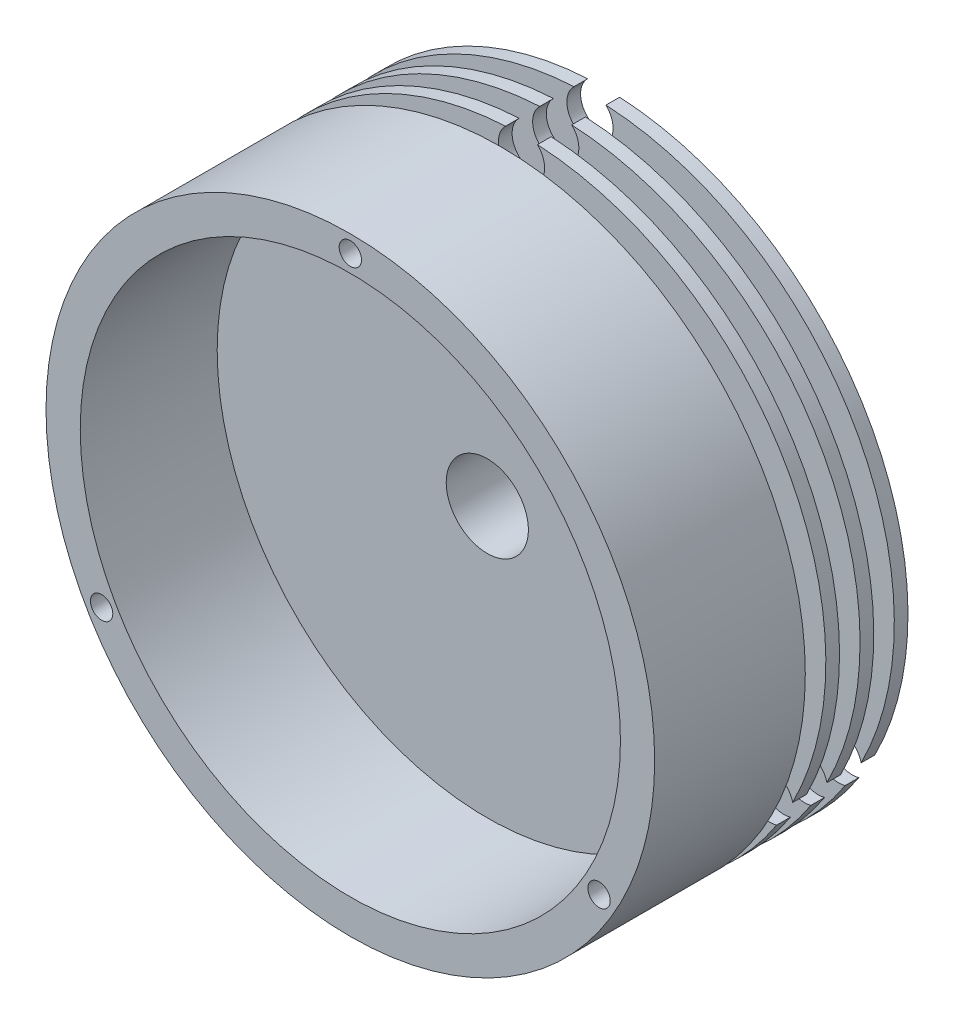
ISO-10303-21;
HEADER;
FILE_DESCRIPTION(('STEP AP214'),'2;1');
FILE_NAME('part.step','',(''),(''),'','','');
FILE_SCHEMA(('AUTOMOTIVE_DESIGN { 1 0 10303 214 1 1 1 1 }'));
ENDSEC;
DATA;
#1=APPLICATION_CONTEXT('core data for automotive mechanical design processes');
#2=APPLICATION_PROTOCOL_DEFINITION('international standard','automotive_design',2000,#1);
#3=PRODUCT_CONTEXT('',#1,'mechanical');
#4=PRODUCT('Part','Part','',(#3));
#5=PRODUCT_RELATED_PRODUCT_CATEGORY('part','',(#4));
#6=PRODUCT_DEFINITION_FORMATION('','',#4);
#7=PRODUCT_DEFINITION_CONTEXT('part definition',#1,'design');
#8=PRODUCT_DEFINITION('design','',#6,#7);
#9=PRODUCT_DEFINITION_SHAPE('','',#8);
#10=(LENGTH_UNIT() NAMED_UNIT(*) SI_UNIT(.MILLI.,.METRE.));
#11=(NAMED_UNIT(*) PLANE_ANGLE_UNIT() SI_UNIT($,.RADIAN.));
#12=(NAMED_UNIT(*) SI_UNIT($,.STERADIAN.) SOLID_ANGLE_UNIT());
#13=UNCERTAINTY_MEASURE_WITH_UNIT(LENGTH_MEASURE(1.E-05),#10,'distance_accuracy_value','');
#14=(GEOMETRIC_REPRESENTATION_CONTEXT(3) GLOBAL_UNCERTAINTY_ASSIGNED_CONTEXT((#13)) GLOBAL_UNIT_ASSIGNED_CONTEXT((#10,
#11,#12)) REPRESENTATION_CONTEXT('',''));
#15=CARTESIAN_POINT('',(0.,0.,0.));
#16=DIRECTION('',(0.,0.,1.));
#17=DIRECTION('',(1.,0.,0.));
#18=AXIS2_PLACEMENT_3D('',#15,#16,#17);
#19=CARTESIAN_POINT('',(0.,0.,20.));
#20=DIRECTION('',(0.,0.,1.));
#21=DIRECTION('',(1.,0.,0.));
#22=AXIS2_PLACEMENT_3D('',#19,#20,#21);
#23=PLANE('',#22);
#24=CARTESIAN_POINT('',(0.,0.,20.));
#25=DIRECTION('',(0.,0.,1.));
#26=DIRECTION('',(1.,0.,0.));
#27=AXIS2_PLACEMENT_3D('',#24,#25,#26);
#28=CIRCLE('',#27,39.45);
#29=CARTESIAN_POINT('',(39.45,0.,20.));
#30=VERTEX_POINT('',#29);
#31=EDGE_CURVE('E693',#30,#30,#28,.T.);
#32=ORIENTED_EDGE('',*,*,#31,.F.);
#33=EDGE_LOOP('',(#32));
#34=FACE_BOUND('',#33,.T.);
#35=CARTESIAN_POINT('',(0.,0.,20.));
#36=DIRECTION('',(0.,0.,1.));
#37=DIRECTION('',(1.,0.,0.));
#38=AXIS2_PLACEMENT_3D('',#35,#36,#37);
#39=CIRCLE('',#38,44.45);
#40=CARTESIAN_POINT('',(44.45,0.,20.));
#41=VERTEX_POINT('',#40);
#42=EDGE_CURVE('E691',#41,#41,#39,.T.);
#43=ORIENTED_EDGE('',*,*,#42,.T.);
#44=EDGE_LOOP('',(#43));
#45=FACE_BOUND('',#44,.T.);
#46=CARTESIAN_POINT('',(0.,41.95,20.));
#47=DIRECTION('',(0.,0.,-1.));
#48=DIRECTION('',(-1.,0.,0.));
#49=AXIS2_PLACEMENT_3D('',#46,#47,#48);
#50=CIRCLE('',#49,1.63194999999999);
#51=CARTESIAN_POINT('',(-1.63194999999999,41.95,20.));
#52=VERTEX_POINT('',#51);
#53=EDGE_CURVE('E272',#52,#52,#50,.T.);
#54=ORIENTED_EDGE('',*,*,#53,.T.);
#55=EDGE_LOOP('',(#54));
#56=FACE_BOUND('',#55,.T.);
#57=CARTESIAN_POINT('',(-36.3297656887571,-20.9750000000002,20.));
#58=DIRECTION('',(0.,0.,-1.));
#59=DIRECTION('',(-1.,0.,0.));
#60=AXIS2_PLACEMENT_3D('',#57,#58,#59);
#61=CIRCLE('',#60,1.63194999999999);
#62=CARTESIAN_POINT('',(-37.9617156887571,-20.9750000000002,20.));
#63=VERTEX_POINT('',#62);
#64=EDGE_CURVE('E304',#63,#63,#61,.T.);
#65=ORIENTED_EDGE('',*,*,#64,.T.);
#66=EDGE_LOOP('',(#65));
#67=FACE_BOUND('',#66,.T.);
#68=CARTESIAN_POINT('',(36.3297656887574,-20.9749999999997,20.));
#69=DIRECTION('',(0.,0.,-1.));
#70=DIRECTION('',(-1.,0.,0.));
#71=AXIS2_PLACEMENT_3D('',#68,#69,#70);
#72=CIRCLE('',#71,1.63194999999999);
#73=CARTESIAN_POINT('',(34.6978156887574,-20.9749999999997,20.));
#74=VERTEX_POINT('',#73);
#75=EDGE_CURVE('E164',#74,#74,#72,.T.);
#76=ORIENTED_EDGE('',*,*,#75,.T.);
#77=EDGE_LOOP('',(#76));
#78=FACE_BOUND('',#77,.T.);
#79=ADVANCED_FACE('F33',(#34,#45,#56,#67,#78),#23,.T.);
#80=CARTESIAN_POINT('',(0.,0.,20.));
#81=DIRECTION('',(0.,0.,-1.));
#82=DIRECTION('',(-1.,0.,0.));
#83=AXIS2_PLACEMENT_3D('',#80,#81,#82);
#84=CYLINDRICAL_SURFACE('',#83,44.45);
#85=CARTESIAN_POINT('',(0.,0.,-17.));
#86=DIRECTION('',(0.,0.,-1.));
#87=DIRECTION('',(-1.,0.,0.));
#88=AXIS2_PLACEMENT_3D('',#85,#86,#87);
#89=CIRCLE('',#88,44.45);
#90=CARTESIAN_POINT('',(37.2768013419675,-24.2124468344588,-17.));
#91=VERTEX_POINT('',#90);
#92=CARTESIAN_POINT('',(-37.2768013419671,-24.2124468344593,-17.));
#93=VERTEX_POINT('',#92);
#94=EDGE_CURVE('E181',#91,#93,#89,.T.);
#95=ORIENTED_EDGE('',*,*,#94,.F.);
#96=DIRECTION('',(0.,0.,-1.));
#97=VECTOR('',#96,1.);
#98=CARTESIAN_POINT('',(37.2768013419674,-24.2124468344587,-9.7864));
#99=LINE('',#98,#97);
#100=CARTESIAN_POINT('',(37.2768013419675,-24.2124468344588,-15.));
#101=VERTEX_POINT('',#100);
#102=EDGE_CURVE('E57',#91,#101,#99,.F.);
#103=ORIENTED_EDGE('',*,*,#102,.T.);
#104=CARTESIAN_POINT('',(0.,0.,-15.));
#105=DIRECTION('',(0.,0.,-1.));
#106=DIRECTION('',(-1.,0.,0.));
#107=AXIS2_PLACEMENT_3D('',#104,#105,#106);
#108=CIRCLE('',#107,44.45);
#109=CARTESIAN_POINT('',(-37.2768013419671,-24.2124468344593,-15.));
#110=VERTEX_POINT('',#109);
#111=EDGE_CURVE('E234',#101,#110,#108,.T.);
#112=ORIENTED_EDGE('',*,*,#111,.T.);
#113=DIRECTION('',(0.,0.,-1.));
#114=VECTOR('',#113,1.);
#115=CARTESIAN_POINT('',(-37.2768013419671,-24.2124468344593,-9.7864));
#116=LINE('',#115,#114);
#117=EDGE_CURVE('E280',#110,#93,#116,.T.);
#118=ORIENTED_EDGE('',*,*,#117,.T.);
#119=EDGE_LOOP('',(#95,#103,#112,#118));
#120=FACE_BOUND('',#119,.T.);
#121=ADVANCED_FACE('F343',(#120),#84,.T.);
#122=CARTESIAN_POINT('',(0.,0.,-12.));
#123=DIRECTION('',(0.,0.,-1.));
#124=DIRECTION('',(-1.,0.,0.));
#125=AXIS2_PLACEMENT_3D('',#122,#123,#124);
#126=CIRCLE('',#125,44.45);
#127=CARTESIAN_POINT('',(37.2768013419675,-24.2124468344587,-12.));
#128=VERTEX_POINT('',#127);
#129=CARTESIAN_POINT('',(-37.2768013419671,-24.2124468344593,-12.));
#130=VERTEX_POINT('',#129);
#131=EDGE_CURVE('E238',#128,#130,#126,.T.);
#132=ORIENTED_EDGE('',*,*,#131,.F.);
#133=DIRECTION('',(0.,0.,-1.));
#134=VECTOR('',#133,1.);
#135=CARTESIAN_POINT('',(37.2768013419674,-24.2124468344587,-9.7864));
#136=LINE('',#135,#134);
#137=CARTESIAN_POINT('',(37.2768013419675,-24.2124468344588,-10.));
#138=VERTEX_POINT('',#137);
#139=EDGE_CURVE('E313',#128,#138,#136,.F.);
#140=ORIENTED_EDGE('',*,*,#139,.T.);
#141=CARTESIAN_POINT('',(0.,0.,-10.));
#142=DIRECTION('',(0.,0.,-1.));
#143=DIRECTION('',(-1.,0.,0.));
#144=AXIS2_PLACEMENT_3D('',#141,#142,#143);
#145=CIRCLE('',#144,44.45);
#146=CARTESIAN_POINT('',(-37.2768013419671,-24.2124468344593,-10.));
#147=VERTEX_POINT('',#146);
#148=EDGE_CURVE('E220',#138,#147,#145,.T.);
#149=ORIENTED_EDGE('',*,*,#148,.T.);
#150=DIRECTION('',(0.,0.,-1.));
#151=VECTOR('',#150,1.);
#152=CARTESIAN_POINT('',(-37.2768013419671,-24.2124468344593,-9.7864));
#153=LINE('',#152,#151);
#154=EDGE_CURVE('E441',#147,#130,#153,.T.);
#155=ORIENTED_EDGE('',*,*,#154,.T.);
#156=EDGE_LOOP('',(#132,#140,#149,#155));
#157=FACE_BOUND('',#156,.T.);
#158=ADVANCED_FACE('F348',(#157),#84,.T.);
#159=CARTESIAN_POINT('',(0.,0.,-7.));
#160=DIRECTION('',(0.,0.,-1.));
#161=DIRECTION('',(-1.,0.,0.));
#162=AXIS2_PLACEMENT_3D('',#159,#160,#161);
#163=CIRCLE('',#162,44.45);
#164=CARTESIAN_POINT('',(37.2768013419675,-24.2124468344588,-7.));
#165=VERTEX_POINT('',#164);
#166=CARTESIAN_POINT('',(-37.2768013419671,-24.2124468344593,-7.));
#167=VERTEX_POINT('',#166);
#168=EDGE_CURVE('E226',#165,#167,#163,.T.);
#169=ORIENTED_EDGE('',*,*,#168,.F.);
#170=DIRECTION('',(0.,0.,-1.));
#171=VECTOR('',#170,1.);
#172=CARTESIAN_POINT('',(37.2768013419674,-24.2124468344587,-9.7864));
#173=LINE('',#172,#171);
#174=CARTESIAN_POINT('',(37.2768013419675,-24.2124468344588,-5.));
#175=VERTEX_POINT('',#174);
#176=EDGE_CURVE('E11',#165,#175,#173,.F.);
#177=ORIENTED_EDGE('',*,*,#176,.T.);
#178=CARTESIAN_POINT('',(0.,0.,-5.));
#179=DIRECTION('',(0.,0.,-1.));
#180=DIRECTION('',(-1.,0.,0.));
#181=AXIS2_PLACEMENT_3D('',#178,#179,#180);
#182=CIRCLE('',#181,44.45);
#183=CARTESIAN_POINT('',(-37.2768013419671,-24.2124468344593,-5.));
#184=VERTEX_POINT('',#183);
#185=EDGE_CURVE('E204',#175,#184,#182,.T.);
#186=ORIENTED_EDGE('',*,*,#185,.T.);
#187=DIRECTION('',(0.,0.,-1.));
#188=VECTOR('',#187,1.);
#189=CARTESIAN_POINT('',(-37.2768013419671,-24.2124468344593,-9.7864));
#190=LINE('',#189,#188);
#191=EDGE_CURVE('E295',#184,#167,#190,.T.);
#192=ORIENTED_EDGE('',*,*,#191,.T.);
#193=EDGE_LOOP('',(#169,#177,#186,#192));
#194=FACE_BOUND('',#193,.T.);
#195=ADVANCED_FACE('F478',(#194),#84,.T.);
#196=CARTESIAN_POINT('',(-39.6069947174052,-20.1764335167401,-17.));
#197=VERTEX_POINT('',#196);
#198=CARTESIAN_POINT('',(-2.33019337543807,44.388880351199,-17.));
#199=VERTEX_POINT('',#198);
#200=EDGE_CURVE('E183',#197,#199,#89,.T.);
#201=ORIENTED_EDGE('',*,*,#200,.F.);
#202=DIRECTION('',(0.,0.,-1.));
#203=VECTOR('',#202,1.);
#204=CARTESIAN_POINT('',(-39.6069947174052,-20.1764335167401,-9.7864));
#205=LINE('',#204,#203);
#206=CARTESIAN_POINT('',(-39.6069947174053,-20.1764335167401,-15.));
#207=VERTEX_POINT('',#206);
#208=EDGE_CURVE('E277',#197,#207,#205,.F.);
#209=ORIENTED_EDGE('',*,*,#208,.T.);
#210=CARTESIAN_POINT('',(-2.33019337543812,44.3888803511991,-15.));
#211=VERTEX_POINT('',#210);
#212=EDGE_CURVE('E235',#207,#211,#108,.T.);
#213=ORIENTED_EDGE('',*,*,#212,.T.);
#214=DIRECTION('',(0.,0.,-1.));
#215=VECTOR('',#214,1.);
#216=CARTESIAN_POINT('',(-2.33019337543807,44.388880351199,-9.7864));
#217=LINE('',#216,#215);
#218=EDGE_CURVE('E248',#211,#199,#217,.T.);
#219=ORIENTED_EDGE('',*,*,#218,.T.);
#220=EDGE_LOOP('',(#201,#209,#213,#219));
#221=FACE_BOUND('',#220,.T.);
#222=ADVANCED_FACE('F549',(#221),#84,.T.);
#223=CARTESIAN_POINT('',(-39.6069947174053,-20.1764335167401,-7.));
#224=VERTEX_POINT('',#223);
#225=CARTESIAN_POINT('',(-2.33019337543808,44.3888803511991,-7.));
#226=VERTEX_POINT('',#225);
#227=EDGE_CURVE('E219',#224,#226,#163,.T.);
#228=ORIENTED_EDGE('',*,*,#227,.F.);
#229=DIRECTION('',(0.,0.,-1.));
#230=VECTOR('',#229,1.);
#231=CARTESIAN_POINT('',(-39.6069947174052,-20.1764335167401,-9.7864));
#232=LINE('',#231,#230);
#233=CARTESIAN_POINT('',(-39.6069947174053,-20.1764335167401,-5.));
#234=VERTEX_POINT('',#233);
#235=EDGE_CURVE('E286',#224,#234,#232,.F.);
#236=ORIENTED_EDGE('',*,*,#235,.T.);
#237=CARTESIAN_POINT('',(-2.33019337543808,44.3888803511991,-5.));
#238=VERTEX_POINT('',#237);
#239=EDGE_CURVE('E205',#234,#238,#182,.T.);
#240=ORIENTED_EDGE('',*,*,#239,.T.);
#241=DIRECTION('',(0.,0.,-1.));
#242=VECTOR('',#241,1.);
#243=CARTESIAN_POINT('',(-2.33019337543807,44.388880351199,-9.7864));
#244=LINE('',#243,#242);
#245=EDGE_CURVE('E263',#238,#226,#244,.T.);
#246=ORIENTED_EDGE('',*,*,#245,.T.);
#247=EDGE_LOOP('',(#228,#236,#240,#246));
#248=FACE_BOUND('',#247,.T.);
#249=ADVANCED_FACE('F472',(#248),#84,.T.);
#250=CARTESIAN_POINT('',(-39.6069947174053,-20.1764335167401,-12.));
#251=VERTEX_POINT('',#250);
#252=CARTESIAN_POINT('',(-2.33019337543808,44.3888803511991,-12.));
#253=VERTEX_POINT('',#252);
#254=EDGE_CURVE('E233',#251,#253,#126,.T.);
#255=ORIENTED_EDGE('',*,*,#254,.F.);
#256=DIRECTION('',(0.,0.,-1.));
#257=VECTOR('',#256,1.);
#258=CARTESIAN_POINT('',(-39.6069947174052,-20.1764335167401,-9.7864));
#259=LINE('',#258,#257);
#260=CARTESIAN_POINT('',(-39.6069947174053,-20.1764335167401,-10.));
#261=VERTEX_POINT('',#260);
#262=EDGE_CURVE('E443',#251,#261,#259,.F.);
#263=ORIENTED_EDGE('',*,*,#262,.T.);
#264=CARTESIAN_POINT('',(-2.33019337543808,44.3888803511991,-10.));
#265=VERTEX_POINT('',#264);
#266=EDGE_CURVE('E221',#261,#265,#145,.T.);
#267=ORIENTED_EDGE('',*,*,#266,.T.);
#268=DIRECTION('',(0.,0.,-1.));
#269=VECTOR('',#268,1.);
#270=CARTESIAN_POINT('',(-2.33019337543807,44.388880351199,-9.7864));
#271=LINE('',#270,#269);
#272=EDGE_CURVE('E452',#265,#253,#271,.T.);
#273=ORIENTED_EDGE('',*,*,#272,.T.);
#274=EDGE_LOOP('',(#255,#263,#267,#273));
#275=FACE_BOUND('',#274,.T.);
#276=ADVANCED_FACE('F567',(#275),#84,.T.);
#277=ORIENTED_EDGE('',*,*,#42,.F.);
#278=EDGE_LOOP('',(#277));
#279=FACE_BOUND('',#278,.T.);
#280=CARTESIAN_POINT('',(0.,0.,-2.));
#281=DIRECTION('',(0.,0.,-1.));
#282=DIRECTION('',(-1.,0.,0.));
#283=AXIS2_PLACEMENT_3D('',#280,#281,#282);
#284=CIRCLE('',#283,44.45);
#285=CARTESIAN_POINT('',(-44.45,0.,-2.));
#286=VERTEX_POINT('',#285);
#287=EDGE_CURVE('E203',#286,#286,#284,.T.);
#288=ORIENTED_EDGE('',*,*,#287,.F.);
#289=EDGE_LOOP('',(#288));
#290=FACE_BOUND('',#289,.T.);
#291=ADVANCED_FACE('F576',(#279,#290),#84,.T.);
#292=CARTESIAN_POINT('',(2.33019337543812,44.3888803511991,-15.));
#293=VERTEX_POINT('',#292);
#294=CARTESIAN_POINT('',(39.6069947174055,-20.1764335167396,-15.));
#295=VERTEX_POINT('',#294);
#296=EDGE_CURVE('E172',#293,#295,#108,.T.);
#297=ORIENTED_EDGE('',*,*,#296,.T.);
#298=DIRECTION('',(0.,0.,-1.));
#299=VECTOR('',#298,1.);
#300=CARTESIAN_POINT('',(39.6069947174055,-20.1764335167396,-9.7864));
#301=LINE('',#300,#299);
#302=CARTESIAN_POINT('',(39.6069947174055,-20.1764335167396,-17.));
#303=VERTEX_POINT('',#302);
#304=EDGE_CURVE('E159',#295,#303,#301,.T.);
#305=ORIENTED_EDGE('',*,*,#304,.T.);
#306=CARTESIAN_POINT('',(2.33019337543807,44.388880351199,-17.));
#307=VERTEX_POINT('',#306);
#308=EDGE_CURVE('E170',#307,#303,#89,.T.);
#309=ORIENTED_EDGE('',*,*,#308,.F.);
#310=DIRECTION('',(0.,0.,-1.));
#311=VECTOR('',#310,1.);
#312=CARTESIAN_POINT('',(2.33019337543807,44.388880351199,-9.7864));
#313=LINE('',#312,#311);
#314=EDGE_CURVE('E246',#307,#293,#313,.F.);
#315=ORIENTED_EDGE('',*,*,#314,.T.);
#316=EDGE_LOOP('',(#297,#305,#309,#315));
#317=FACE_BOUND('',#316,.T.);
#318=ADVANCED_FACE('F35',(#317),#84,.T.);
#319=CARTESIAN_POINT('',(0.,0.,-20.));
#320=DIRECTION('',(0.,0.,-1.));
#321=DIRECTION('',(-1.,0.,0.));
#322=AXIS2_PLACEMENT_3D('',#319,#320,#321);
#323=PLANE('',#322);
#324=CARTESIAN_POINT('',(0.,0.,-20.));
#325=DIRECTION('',(0.,0.,-1.));
#326=DIRECTION('',(-1.,0.,0.));
#327=AXIS2_PLACEMENT_3D('',#324,#325,#326);
#328=CIRCLE('',#327,6.);
#329=CARTESIAN_POINT('',(-6.,0.,-20.));
#330=VERTEX_POINT('',#329);
#331=EDGE_CURVE('E185',#330,#330,#328,.T.);
#332=ORIENTED_EDGE('',*,*,#331,.F.);
#333=EDGE_LOOP('',(#332));
#334=FACE_BOUND('',#333,.T.);
#335=CARTESIAN_POINT('',(0.,0.,-20.));
#336=DIRECTION('',(0.,0.,-1.));
#337=DIRECTION('',(-1.,0.,0.));
#338=AXIS2_PLACEMENT_3D('',#335,#336,#337);
#339=CIRCLE('',#338,33.45);
#340=CARTESIAN_POINT('',(-33.45,0.,-20.));
#341=VERTEX_POINT('',#340);
#342=EDGE_CURVE('E193',#341,#341,#339,.T.);
#343=ORIENTED_EDGE('',*,*,#342,.T.);
#344=EDGE_LOOP('',(#343));
#345=FACE_BOUND('',#344,.T.);
#346=ADVANCED_FACE('F357',(#334,#345),#323,.T.);
#347=CARTESIAN_POINT('',(0.,0.,20.));
#348=DIRECTION('',(0.,0.,-1.));
#349=DIRECTION('',(-1.,0.,0.));
#350=AXIS2_PLACEMENT_3D('',#347,#348,#349);
#351=CYLINDRICAL_SURFACE('',#350,39.45);
#352=ORIENTED_EDGE('',*,*,#31,.T.);
#353=EDGE_LOOP('',(#352));
#354=FACE_BOUND('',#353,.T.);
#355=CARTESIAN_POINT('',(0.,0.,0.));
#356=DIRECTION('',(0.,0.,1.));
#357=DIRECTION('',(1.,0.,0.));
#358=AXIS2_PLACEMENT_3D('',#355,#356,#357);
#359=CIRCLE('',#358,39.45);
#360=CARTESIAN_POINT('',(39.45,0.,0.));
#361=VERTEX_POINT('',#360);
#362=EDGE_CURVE('E696',#361,#361,#359,.T.);
#363=ORIENTED_EDGE('',*,*,#362,.F.);
#364=EDGE_LOOP('',(#363));
#365=FACE_BOUND('',#364,.T.);
#366=ADVANCED_FACE('F353',(#354,#365),#351,.F.);
#367=CARTESIAN_POINT('',(0.,0.,0.));
#368=DIRECTION('',(0.,0.,-1.));
#369=DIRECTION('',(-1.,0.,0.));
#370=AXIS2_PLACEMENT_3D('',#367,#368,#369);
#371=PLANE('',#370);
#372=CARTESIAN_POINT('',(0.,0.,0.));
#373=DIRECTION('',(0.,0.,-1.));
#374=DIRECTION('',(-1.,0.,0.));
#375=AXIS2_PLACEMENT_3D('',#372,#373,#374);
#376=CIRCLE('',#375,6.);
#377=CARTESIAN_POINT('',(-6.,0.,0.));
#378=VERTEX_POINT('',#377);
#379=EDGE_CURVE('E180',#378,#378,#376,.T.);
#380=ORIENTED_EDGE('',*,*,#379,.T.);
#381=EDGE_LOOP('',(#380));
#382=FACE_BOUND('',#381,.T.);
#383=ORIENTED_EDGE('',*,*,#362,.T.);
#384=EDGE_LOOP('',(#383));
#385=FACE_BOUND('',#384,.T.);
#386=ADVANCED_FACE('F356',(#382,#385),#371,.F.);
#387=CARTESIAN_POINT('',(0.,0.,-20.));
#388=DIRECTION('',(0.,0.,1.));
#389=DIRECTION('',(1.,0.,0.));
#390=AXIS2_PLACEMENT_3D('',#387,#388,#389);
#391=CYLINDRICAL_SURFACE('',#390,6.);
#392=ORIENTED_EDGE('',*,*,#331,.T.);
#393=EDGE_LOOP('',(#392));
#394=FACE_BOUND('',#393,.T.);
#395=ORIENTED_EDGE('',*,*,#379,.F.);
#396=EDGE_LOOP('',(#395));
#397=FACE_BOUND('',#396,.T.);
#398=ADVANCED_FACE('F361',(#394,#397),#391,.F.);
#399=CARTESIAN_POINT('',(0.,0.,-17.));
#400=DIRECTION('',(0.,0.,-1.));
#401=DIRECTION('',(-1.,0.,0.));
#402=AXIS2_PLACEMENT_3D('',#399,#400,#401);
#403=PLANE('',#402);
#404=CARTESIAN_POINT('',(36.3297656887574,-20.9749999999997,-17.));
#405=DIRECTION('',(0.,0.,-1.));
#406=DIRECTION('',(-1.,0.,0.));
#407=AXIS2_PLACEMENT_3D('',#404,#405,#406);
#408=CIRCLE('',#407,3.37311999999999);
#409=EDGE_CURVE('E156',#91,#303,#408,.T.);
#410=ORIENTED_EDGE('',*,*,#409,.F.);
#411=ORIENTED_EDGE('',*,*,#94,.T.);
#412=CARTESIAN_POINT('',(-36.3297656887571,-20.9750000000002,-17.));
#413=DIRECTION('',(0.,0.,-1.));
#414=DIRECTION('',(-1.,0.,0.));
#415=AXIS2_PLACEMENT_3D('',#412,#413,#414);
#416=CIRCLE('',#415,3.37311999999999);
#417=EDGE_CURVE('E307',#197,#93,#416,.T.);
#418=ORIENTED_EDGE('',*,*,#417,.F.);
#419=ORIENTED_EDGE('',*,*,#200,.T.);
#420=CARTESIAN_POINT('',(0.,41.95,-17.));
#421=DIRECTION('',(0.,0.,-1.));
#422=DIRECTION('',(-1.,0.,0.));
#423=AXIS2_PLACEMENT_3D('',#420,#421,#422);
#424=CIRCLE('',#423,3.37311999999999);
#425=EDGE_CURVE('E179',#307,#199,#424,.T.);
#426=ORIENTED_EDGE('',*,*,#425,.F.);
#427=ORIENTED_EDGE('',*,*,#308,.T.);
#428=EDGE_LOOP('',(#410,#411,#418,#419,#426,#427));
#429=FACE_BOUND('',#428,.T.);
#430=CARTESIAN_POINT('',(0.,0.,-17.));
#431=DIRECTION('',(0.,0.,-1.));
#432=DIRECTION('',(-1.,0.,0.));
#433=AXIS2_PLACEMENT_3D('',#430,#431,#432);
#434=CIRCLE('',#433,33.45);
#435=CARTESIAN_POINT('',(-33.45,0.,-17.));
#436=VERTEX_POINT('',#435);
#437=EDGE_CURVE('E189',#436,#436,#434,.T.);
#438=ORIENTED_EDGE('',*,*,#437,.F.);
#439=EDGE_LOOP('',(#438));
#440=FACE_BOUND('',#439,.T.);
#441=ADVANCED_FACE('F176',(#429,#440),#403,.T.);
#442=CARTESIAN_POINT('',(0.,0.,-17.));
#443=DIRECTION('',(0.,0.,-1.));
#444=DIRECTION('',(-1.,0.,0.));
#445=AXIS2_PLACEMENT_3D('',#442,#443,#444);
#446=CYLINDRICAL_SURFACE('',#445,33.45);
#447=ORIENTED_EDGE('',*,*,#437,.T.);
#448=EDGE_LOOP('',(#447));
#449=FACE_BOUND('',#448,.T.);
#450=ORIENTED_EDGE('',*,*,#342,.F.);
#451=EDGE_LOOP('',(#450));
#452=FACE_BOUND('',#451,.T.);
#453=ADVANCED_FACE('F371',(#449,#452),#446,.T.);
#454=CARTESIAN_POINT('',(0.,0.,-2.));
#455=DIRECTION('',(0.,0.,-1.));
#456=DIRECTION('',(-1.,0.,0.));
#457=AXIS2_PLACEMENT_3D('',#454,#455,#456);
#458=PLANE('',#457);
#459=CARTESIAN_POINT('',(36.3297656887574,-20.9749999999997,-2.));
#460=DIRECTION('',(0.,0.,-1.));
#461=DIRECTION('',(-1.,0.,0.));
#462=AXIS2_PLACEMENT_3D('',#459,#460,#461);
#463=CIRCLE('',#462,1.63194999999999);
#464=CARTESIAN_POINT('',(34.6978156887574,-20.9749999999997,-2.));
#465=VERTEX_POINT('',#464);
#466=EDGE_CURVE('E37',#465,#465,#463,.T.);
#467=ORIENTED_EDGE('',*,*,#466,.F.);
#468=EDGE_LOOP('',(#467));
#469=FACE_BOUND('',#468,.T.);
#470=CARTESIAN_POINT('',(-36.3297656887571,-20.9750000000002,-2.));
#471=DIRECTION('',(0.,0.,-1.));
#472=DIRECTION('',(-1.,0.,0.));
#473=AXIS2_PLACEMENT_3D('',#470,#471,#472);
#474=CIRCLE('',#473,1.63194999999999);
#475=CARTESIAN_POINT('',(-37.9617156887571,-20.9750000000002,-2.));
#476=VERTEX_POINT('',#475);
#477=EDGE_CURVE('E276',#476,#476,#474,.T.);
#478=ORIENTED_EDGE('',*,*,#477,.F.);
#479=EDGE_LOOP('',(#478));
#480=FACE_BOUND('',#479,.T.);
#481=CARTESIAN_POINT('',(0.,41.95,-2.));
#482=DIRECTION('',(0.,0.,-1.));
#483=DIRECTION('',(-1.,0.,0.));
#484=AXIS2_PLACEMENT_3D('',#481,#482,#483);
#485=CIRCLE('',#484,1.63194999999999);
#486=CARTESIAN_POINT('',(-1.63194999999999,41.95,-2.));
#487=VERTEX_POINT('',#486);
#488=EDGE_CURVE('E213',#487,#487,#485,.T.);
#489=ORIENTED_EDGE('',*,*,#488,.F.);
#490=EDGE_LOOP('',(#489));
#491=FACE_BOUND('',#490,.T.);
#492=CARTESIAN_POINT('',(0.,0.,-2.));
#493=DIRECTION('',(0.,0.,-1.));
#494=DIRECTION('',(-1.,0.,0.));
#495=AXIS2_PLACEMENT_3D('',#492,#493,#494);
#496=CIRCLE('',#495,33.45);
#497=CARTESIAN_POINT('',(-33.45,0.,-2.));
#498=VERTEX_POINT('',#497);
#499=EDGE_CURVE('E212',#498,#498,#496,.T.);
#500=ORIENTED_EDGE('',*,*,#499,.F.);
#501=EDGE_LOOP('',(#500));
#502=FACE_BOUND('',#501,.T.);
#503=ORIENTED_EDGE('',*,*,#287,.T.);
#504=EDGE_LOOP('',(#503));
#505=FACE_BOUND('',#504,.T.);
#506=ADVANCED_FACE('F374',(#469,#480,#491,#502,#505),#458,.T.);
#507=CARTESIAN_POINT('',(0.,0.,-5.));
#508=DIRECTION('',(0.,0.,-1.));
#509=DIRECTION('',(-1.,0.,0.));
#510=AXIS2_PLACEMENT_3D('',#507,#508,#509);
#511=PLANE('',#510);
#512=CARTESIAN_POINT('',(0.,0.,-5.));
#513=DIRECTION('',(0.,0.,-1.));
#514=DIRECTION('',(-1.,0.,0.));
#515=AXIS2_PLACEMENT_3D('',#512,#513,#514);
#516=CIRCLE('',#515,33.45);
#517=CARTESIAN_POINT('',(-33.45,0.,-5.));
#518=VERTEX_POINT('',#517);
#519=EDGE_CURVE('E209',#518,#518,#516,.T.);
#520=ORIENTED_EDGE('',*,*,#519,.T.);
#521=EDGE_LOOP('',(#520));
#522=FACE_BOUND('',#521,.T.);
#523=ORIENTED_EDGE('',*,*,#185,.F.);
#524=CARTESIAN_POINT('',(36.3297656887574,-20.9749999999997,-5.));
#525=DIRECTION('',(0.,0.,-1.));
#526=DIRECTION('',(-1.,0.,0.));
#527=AXIS2_PLACEMENT_3D('',#524,#525,#526);
#528=CIRCLE('',#527,3.37312);
#529=CARTESIAN_POINT('',(39.6069947174055,-20.1764335167396,-5.));
#530=VERTEX_POINT('',#529);
#531=EDGE_CURVE('E321',#175,#530,#528,.T.);
#532=ORIENTED_EDGE('',*,*,#531,.T.);
#533=CARTESIAN_POINT('',(2.33019337543807,44.3888803511991,-5.));
#534=VERTEX_POINT('',#533);
#535=EDGE_CURVE('E200',#534,#530,#182,.T.);
#536=ORIENTED_EDGE('',*,*,#535,.F.);
#537=CARTESIAN_POINT('',(0.,41.95,-5.));
#538=DIRECTION('',(0.,0.,-1.));
#539=DIRECTION('',(-1.,0.,0.));
#540=AXIS2_PLACEMENT_3D('',#537,#538,#539);
#541=CIRCLE('',#540,3.37312);
#542=EDGE_CURVE('E254',#534,#238,#541,.T.);
#543=ORIENTED_EDGE('',*,*,#542,.T.);
#544=ORIENTED_EDGE('',*,*,#239,.F.);
#545=CARTESIAN_POINT('',(-36.3297656887571,-20.9750000000002,-5.));
#546=DIRECTION('',(0.,0.,-1.));
#547=DIRECTION('',(-1.,0.,0.));
#548=AXIS2_PLACEMENT_3D('',#545,#546,#547);
#549=CIRCLE('',#548,3.37311999999999);
#550=EDGE_CURVE('E289',#234,#184,#549,.T.);
#551=ORIENTED_EDGE('',*,*,#550,.T.);
#552=EDGE_LOOP('',(#523,#532,#536,#543,#544,#551));
#553=FACE_BOUND('',#552,.T.);
#554=ADVANCED_FACE('F375',(#522,#553),#511,.F.);
#555=CARTESIAN_POINT('',(0.,0.,-2.));
#556=DIRECTION('',(0.,0.,-1.));
#557=DIRECTION('',(-1.,0.,0.));
#558=AXIS2_PLACEMENT_3D('',#555,#556,#557);
#559=CYLINDRICAL_SURFACE('',#558,33.45);
#560=ORIENTED_EDGE('',*,*,#499,.T.);
#561=EDGE_LOOP('',(#560));
#562=FACE_BOUND('',#561,.T.);
#563=ORIENTED_EDGE('',*,*,#519,.F.);
#564=EDGE_LOOP('',(#563));
#565=FACE_BOUND('',#564,.T.);
#566=ADVANCED_FACE('F378',(#562,#565),#559,.T.);
#567=CARTESIAN_POINT('',(0.,0.,-12.));
#568=DIRECTION('',(0.,0.,-1.));
#569=DIRECTION('',(-1.,0.,0.));
#570=AXIS2_PLACEMENT_3D('',#567,#568,#569);
#571=PLANE('',#570);
#572=CARTESIAN_POINT('',(36.3297656887574,-20.9749999999997,-12.));
#573=DIRECTION('',(0.,0.,-1.));
#574=DIRECTION('',(-1.,0.,0.));
#575=AXIS2_PLACEMENT_3D('',#572,#573,#574);
#576=CIRCLE('',#575,3.37312);
#577=CARTESIAN_POINT('',(39.6069947174055,-20.1764335167396,-12.));
#578=VERTEX_POINT('',#577);
#579=EDGE_CURVE('E49',#128,#578,#576,.T.);
#580=ORIENTED_EDGE('',*,*,#579,.F.);
#581=ORIENTED_EDGE('',*,*,#131,.T.);
#582=CARTESIAN_POINT('',(-36.3297656887571,-20.9750000000002,-12.));
#583=DIRECTION('',(0.,0.,-1.));
#584=DIRECTION('',(-1.,0.,0.));
#585=AXIS2_PLACEMENT_3D('',#582,#583,#584);
#586=CIRCLE('',#585,3.37311999999999);
#587=EDGE_CURVE('E298',#251,#130,#586,.T.);
#588=ORIENTED_EDGE('',*,*,#587,.F.);
#589=ORIENTED_EDGE('',*,*,#254,.T.);
#590=CARTESIAN_POINT('',(0.,41.95,-12.));
#591=DIRECTION('',(0.,0.,-1.));
#592=DIRECTION('',(-1.,0.,0.));
#593=AXIS2_PLACEMENT_3D('',#590,#591,#592);
#594=CIRCLE('',#593,3.37312);
#595=CARTESIAN_POINT('',(2.33019337543812,44.3888803511991,-12.));
#596=VERTEX_POINT('',#595);
#597=EDGE_CURVE('E266',#596,#253,#594,.T.);
#598=ORIENTED_EDGE('',*,*,#597,.F.);
#599=EDGE_CURVE('E198',#596,#578,#126,.T.);
#600=ORIENTED_EDGE('',*,*,#599,.T.);
#601=EDGE_LOOP('',(#580,#581,#588,#589,#598,#600));
#602=FACE_BOUND('',#601,.T.);
#603=CARTESIAN_POINT('',(0.,0.,-12.));
#604=DIRECTION('',(0.,0.,-1.));
#605=DIRECTION('',(-1.,0.,0.));
#606=AXIS2_PLACEMENT_3D('',#603,#604,#605);
#607=CIRCLE('',#606,33.45);
#608=CARTESIAN_POINT('',(-33.45,0.,-12.));
#609=VERTEX_POINT('',#608);
#610=EDGE_CURVE('E241',#609,#609,#607,.T.);
#611=ORIENTED_EDGE('',*,*,#610,.F.);
#612=EDGE_LOOP('',(#611));
#613=FACE_BOUND('',#612,.T.);
#614=ADVANCED_FACE('F385',(#602,#613),#571,.T.);
#615=CARTESIAN_POINT('',(0.,0.,-15.));
#616=DIRECTION('',(0.,0.,-1.));
#617=DIRECTION('',(-1.,0.,0.));
#618=AXIS2_PLACEMENT_3D('',#615,#616,#617);
#619=PLANE('',#618);
#620=CARTESIAN_POINT('',(0.,0.,-15.));
#621=DIRECTION('',(0.,0.,-1.));
#622=DIRECTION('',(-1.,0.,0.));
#623=AXIS2_PLACEMENT_3D('',#620,#621,#622);
#624=CIRCLE('',#623,33.45);
#625=CARTESIAN_POINT('',(-33.45,0.,-15.));
#626=VERTEX_POINT('',#625);
#627=EDGE_CURVE('E225',#626,#626,#624,.T.);
#628=ORIENTED_EDGE('',*,*,#627,.T.);
#629=EDGE_LOOP('',(#628));
#630=FACE_BOUND('',#629,.T.);
#631=ORIENTED_EDGE('',*,*,#111,.F.);
#632=CARTESIAN_POINT('',(36.3297656887574,-20.9749999999997,-15.));
#633=DIRECTION('',(0.,0.,-1.));
#634=DIRECTION('',(-1.,0.,0.));
#635=AXIS2_PLACEMENT_3D('',#632,#633,#634);
#636=CIRCLE('',#635,3.37312);
#637=EDGE_CURVE('E173',#101,#295,#636,.T.);
#638=ORIENTED_EDGE('',*,*,#637,.T.);
#639=ORIENTED_EDGE('',*,*,#296,.F.);
#640=CARTESIAN_POINT('',(0.,41.95,-15.));
#641=DIRECTION('',(0.,0.,-1.));
#642=DIRECTION('',(-1.,0.,0.));
#643=AXIS2_PLACEMENT_3D('',#640,#641,#642);
#644=CIRCLE('',#643,3.37312);
#645=EDGE_CURVE('E251',#293,#211,#644,.T.);
#646=ORIENTED_EDGE('',*,*,#645,.T.);
#647=ORIENTED_EDGE('',*,*,#212,.F.);
#648=CARTESIAN_POINT('',(-36.3297656887571,-20.9750000000002,-15.));
#649=DIRECTION('',(0.,0.,-1.));
#650=DIRECTION('',(-1.,0.,0.));
#651=AXIS2_PLACEMENT_3D('',#648,#649,#650);
#652=CIRCLE('',#651,3.37311999999999);
#653=EDGE_CURVE('E283',#207,#110,#652,.T.);
#654=ORIENTED_EDGE('',*,*,#653,.T.);
#655=EDGE_LOOP('',(#631,#638,#639,#646,#647,#654));
#656=FACE_BOUND('',#655,.T.);
#657=ADVANCED_FACE('F401',(#630,#656),#619,.F.);
#658=CARTESIAN_POINT('',(0.,0.,-12.));
#659=DIRECTION('',(0.,0.,-1.));
#660=DIRECTION('',(-1.,0.,0.));
#661=AXIS2_PLACEMENT_3D('',#658,#659,#660);
#662=CYLINDRICAL_SURFACE('',#661,33.45);
#663=ORIENTED_EDGE('',*,*,#610,.T.);
#664=EDGE_LOOP('',(#663));
#665=FACE_BOUND('',#664,.T.);
#666=ORIENTED_EDGE('',*,*,#627,.F.);
#667=EDGE_LOOP('',(#666));
#668=FACE_BOUND('',#667,.T.);
#669=ADVANCED_FACE('F404',(#665,#668),#662,.T.);
#670=ORIENTED_EDGE('',*,*,#535,.T.);
#671=DIRECTION('',(0.,0.,-1.));
#672=VECTOR('',#671,1.);
#673=CARTESIAN_POINT('',(39.6069947174055,-20.1764335167396,-9.7864));
#674=LINE('',#673,#672);
#675=CARTESIAN_POINT('',(39.6069947174055,-20.1764335167396,-7.));
#676=VERTEX_POINT('',#675);
#677=EDGE_CURVE('E42',#530,#676,#674,.T.);
#678=ORIENTED_EDGE('',*,*,#677,.T.);
#679=CARTESIAN_POINT('',(2.33019337543812,44.3888803511991,-7.));
#680=VERTEX_POINT('',#679);
#681=EDGE_CURVE('E222',#680,#676,#163,.T.);
#682=ORIENTED_EDGE('',*,*,#681,.F.);
#683=DIRECTION('',(0.,0.,-1.));
#684=VECTOR('',#683,1.);
#685=CARTESIAN_POINT('',(2.33019337543807,44.388880351199,-9.7864));
#686=LINE('',#685,#684);
#687=EDGE_CURVE('E257',#680,#534,#686,.F.);
#688=ORIENTED_EDGE('',*,*,#687,.T.);
#689=EDGE_LOOP('',(#670,#678,#682,#688));
#690=FACE_BOUND('',#689,.T.);
#691=ADVANCED_FACE('F411',(#690),#84,.T.);
#692=CARTESIAN_POINT('',(2.33019337543812,44.3888803511991,-10.));
#693=VERTEX_POINT('',#692);
#694=CARTESIAN_POINT('',(39.6069947174055,-20.1764335167396,-10.));
#695=VERTEX_POINT('',#694);
#696=EDGE_CURVE('E216',#693,#695,#145,.T.);
#697=ORIENTED_EDGE('',*,*,#696,.T.);
#698=DIRECTION('',(0.,0.,-1.));
#699=VECTOR('',#698,1.);
#700=CARTESIAN_POINT('',(39.6069947174055,-20.1764335167396,-9.7864));
#701=LINE('',#700,#699);
#702=EDGE_CURVE('E319',#695,#578,#701,.T.);
#703=ORIENTED_EDGE('',*,*,#702,.T.);
#704=ORIENTED_EDGE('',*,*,#599,.F.);
#705=DIRECTION('',(0.,0.,-1.));
#706=VECTOR('',#705,1.);
#707=CARTESIAN_POINT('',(2.33019337543807,44.388880351199,-9.7864));
#708=LINE('',#707,#706);
#709=EDGE_CURVE('E448',#596,#693,#708,.F.);
#710=ORIENTED_EDGE('',*,*,#709,.T.);
#711=EDGE_LOOP('',(#697,#703,#704,#710));
#712=FACE_BOUND('',#711,.T.);
#713=ADVANCED_FACE('F395',(#712),#84,.T.);
#714=CARTESIAN_POINT('',(0.,0.,-7.));
#715=DIRECTION('',(0.,0.,-1.));
#716=DIRECTION('',(-1.,0.,0.));
#717=AXIS2_PLACEMENT_3D('',#714,#715,#716);
#718=PLANE('',#717);
#719=CARTESIAN_POINT('',(36.3297656887574,-20.9749999999997,-7.));
#720=DIRECTION('',(0.,0.,-1.));
#721=DIRECTION('',(-1.,0.,0.));
#722=AXIS2_PLACEMENT_3D('',#719,#720,#721);
#723=CIRCLE('',#722,3.37312);
#724=EDGE_CURVE('E324',#165,#676,#723,.T.);
#725=ORIENTED_EDGE('',*,*,#724,.F.);
#726=ORIENTED_EDGE('',*,*,#168,.T.);
#727=CARTESIAN_POINT('',(-36.3297656887571,-20.9750000000002,-7.));
#728=DIRECTION('',(0.,0.,-1.));
#729=DIRECTION('',(-1.,0.,0.));
#730=AXIS2_PLACEMENT_3D('',#727,#728,#729);
#731=CIRCLE('',#730,3.37311999999999);
#732=EDGE_CURVE('E292',#224,#167,#731,.T.);
#733=ORIENTED_EDGE('',*,*,#732,.F.);
#734=ORIENTED_EDGE('',*,*,#227,.T.);
#735=CARTESIAN_POINT('',(0.,41.95,-7.));
#736=DIRECTION('',(0.,0.,-1.));
#737=DIRECTION('',(-1.,0.,0.));
#738=AXIS2_PLACEMENT_3D('',#735,#736,#737);
#739=CIRCLE('',#738,3.37312);
#740=EDGE_CURVE('E260',#680,#226,#739,.T.);
#741=ORIENTED_EDGE('',*,*,#740,.F.);
#742=ORIENTED_EDGE('',*,*,#681,.T.);
#743=EDGE_LOOP('',(#725,#726,#733,#734,#741,#742));
#744=FACE_BOUND('',#743,.T.);
#745=CARTESIAN_POINT('',(0.,0.,-7.));
#746=DIRECTION('',(0.,0.,-1.));
#747=DIRECTION('',(-1.,0.,0.));
#748=AXIS2_PLACEMENT_3D('',#745,#746,#747);
#749=CIRCLE('',#748,33.45);
#750=CARTESIAN_POINT('',(-33.45,0.,-7.));
#751=VERTEX_POINT('',#750);
#752=EDGE_CURVE('E229',#751,#751,#749,.T.);
#753=ORIENTED_EDGE('',*,*,#752,.F.);
#754=EDGE_LOOP('',(#753));
#755=FACE_BOUND('',#754,.T.);
#756=ADVANCED_FACE('F391',(#744,#755),#718,.T.);
#757=CARTESIAN_POINT('',(0.,0.,-10.));
#758=DIRECTION('',(0.,0.,-1.));
#759=DIRECTION('',(-1.,0.,0.));
#760=AXIS2_PLACEMENT_3D('',#757,#758,#759);
#761=PLANE('',#760);
#762=CARTESIAN_POINT('',(0.,0.,-10.));
#763=DIRECTION('',(0.,0.,-1.));
#764=DIRECTION('',(-1.,0.,0.));
#765=AXIS2_PLACEMENT_3D('',#762,#763,#764);
#766=CIRCLE('',#765,33.45);
#767=CARTESIAN_POINT('',(-33.45,0.,-10.));
#768=VERTEX_POINT('',#767);
#769=EDGE_CURVE('E208',#768,#768,#766,.T.);
#770=ORIENTED_EDGE('',*,*,#769,.T.);
#771=EDGE_LOOP('',(#770));
#772=FACE_BOUND('',#771,.T.);
#773=ORIENTED_EDGE('',*,*,#148,.F.);
#774=CARTESIAN_POINT('',(36.3297656887574,-20.9749999999997,-10.));
#775=DIRECTION('',(0.,0.,-1.));
#776=DIRECTION('',(-1.,0.,0.));
#777=AXIS2_PLACEMENT_3D('',#774,#775,#776);
#778=CIRCLE('',#777,3.37312);
#779=EDGE_CURVE('E316',#138,#695,#778,.T.);
#780=ORIENTED_EDGE('',*,*,#779,.T.);
#781=ORIENTED_EDGE('',*,*,#696,.F.);
#782=CARTESIAN_POINT('',(0.,41.95,-10.));
#783=DIRECTION('',(0.,0.,-1.));
#784=DIRECTION('',(-1.,0.,0.));
#785=AXIS2_PLACEMENT_3D('',#782,#783,#784);
#786=CIRCLE('',#785,3.37312);
#787=EDGE_CURVE('E269',#693,#265,#786,.T.);
#788=ORIENTED_EDGE('',*,*,#787,.T.);
#789=ORIENTED_EDGE('',*,*,#266,.F.);
#790=CARTESIAN_POINT('',(-36.3297656887571,-20.9750000000002,-10.));
#791=DIRECTION('',(0.,0.,-1.));
#792=DIRECTION('',(-1.,0.,0.));
#793=AXIS2_PLACEMENT_3D('',#790,#791,#792);
#794=CIRCLE('',#793,3.37311999999999);
#795=EDGE_CURVE('E301',#261,#147,#794,.T.);
#796=ORIENTED_EDGE('',*,*,#795,.T.);
#797=EDGE_LOOP('',(#773,#780,#781,#788,#789,#796));
#798=FACE_BOUND('',#797,.T.);
#799=ADVANCED_FACE('F387',(#772,#798),#761,.F.);
#800=CARTESIAN_POINT('',(0.,0.,-7.));
#801=DIRECTION('',(0.,0.,-1.));
#802=DIRECTION('',(-1.,0.,0.));
#803=AXIS2_PLACEMENT_3D('',#800,#801,#802);
#804=CYLINDRICAL_SURFACE('',#803,33.45);
#805=ORIENTED_EDGE('',*,*,#752,.T.);
#806=EDGE_LOOP('',(#805));
#807=FACE_BOUND('',#806,.T.);
#808=ORIENTED_EDGE('',*,*,#769,.F.);
#809=EDGE_LOOP('',(#808));
#810=FACE_BOUND('',#809,.T.);
#811=ADVANCED_FACE('F390',(#807,#810),#804,.T.);
#812=CARTESIAN_POINT('',(0.,41.95,-17.));
#813=DIRECTION('',(0.,0.,-1.));
#814=DIRECTION('',(-1.,0.,0.));
#815=AXIS2_PLACEMENT_3D('',#812,#813,#814);
#816=CYLINDRICAL_SURFACE('',#815,3.37312);
#817=ORIENTED_EDGE('',*,*,#597,.T.);
#818=ORIENTED_EDGE('',*,*,#272,.F.);
#819=ORIENTED_EDGE('',*,*,#787,.F.);
#820=ORIENTED_EDGE('',*,*,#709,.F.);
#821=EDGE_LOOP('',(#817,#818,#819,#820));
#822=FACE_BOUND('',#821,.T.);
#823=ADVANCED_FACE('F399',(#822),#816,.F.);
#824=ORIENTED_EDGE('',*,*,#687,.F.);
#825=ORIENTED_EDGE('',*,*,#740,.T.);
#826=ORIENTED_EDGE('',*,*,#245,.F.);
#827=ORIENTED_EDGE('',*,*,#542,.F.);
#828=EDGE_LOOP('',(#824,#825,#826,#827));
#829=FACE_BOUND('',#828,.T.);
#830=ADVANCED_FACE('F417',(#829),#816,.F.);
#831=CARTESIAN_POINT('',(0.,41.95,-17.));
#832=DIRECTION('',(0.,0.,-1.));
#833=DIRECTION('',(-1.,0.,0.));
#834=AXIS2_PLACEMENT_3D('',#831,#832,#833);
#835=CYLINDRICAL_SURFACE('',#834,1.63194999999999);
#836=ORIENTED_EDGE('',*,*,#488,.T.);
#837=EDGE_LOOP('',(#836));
#838=FACE_BOUND('',#837,.T.);
#839=ORIENTED_EDGE('',*,*,#53,.F.);
#840=EDGE_LOOP('',(#839));
#841=FACE_BOUND('',#840,.T.);
#842=ADVANCED_FACE('F413',(#838,#841),#835,.F.);
#843=ORIENTED_EDGE('',*,*,#425,.T.);
#844=ORIENTED_EDGE('',*,*,#218,.F.);
#845=ORIENTED_EDGE('',*,*,#645,.F.);
#846=ORIENTED_EDGE('',*,*,#314,.F.);
#847=EDGE_LOOP('',(#843,#844,#845,#846));
#848=FACE_BOUND('',#847,.T.);
#849=ADVANCED_FACE('F416',(#848),#816,.F.);
#850=CARTESIAN_POINT('',(-36.3297656887571,-20.9750000000002,-17.));
#851=DIRECTION('',(0.,0.,-1.));
#852=DIRECTION('',(-1.,0.,0.));
#853=AXIS2_PLACEMENT_3D('',#850,#851,#852);
#854=CYLINDRICAL_SURFACE('',#853,3.37311999999999);
#855=ORIENTED_EDGE('',*,*,#587,.T.);
#856=ORIENTED_EDGE('',*,*,#154,.F.);
#857=ORIENTED_EDGE('',*,*,#795,.F.);
#858=ORIENTED_EDGE('',*,*,#262,.F.);
#859=EDGE_LOOP('',(#855,#856,#857,#858));
#860=FACE_BOUND('',#859,.T.);
#861=ADVANCED_FACE('F421',(#860),#854,.F.);
#862=ORIENTED_EDGE('',*,*,#732,.T.);
#863=ORIENTED_EDGE('',*,*,#191,.F.);
#864=ORIENTED_EDGE('',*,*,#550,.F.);
#865=ORIENTED_EDGE('',*,*,#235,.F.);
#866=EDGE_LOOP('',(#862,#863,#864,#865));
#867=FACE_BOUND('',#866,.T.);
#868=ADVANCED_FACE('F428',(#867),#854,.F.);
#869=ORIENTED_EDGE('',*,*,#417,.T.);
#870=ORIENTED_EDGE('',*,*,#117,.F.);
#871=ORIENTED_EDGE('',*,*,#653,.F.);
#872=ORIENTED_EDGE('',*,*,#208,.F.);
#873=EDGE_LOOP('',(#869,#870,#871,#872));
#874=FACE_BOUND('',#873,.T.);
#875=ADVANCED_FACE('F425',(#874),#854,.F.);
#876=CARTESIAN_POINT('',(-36.3297656887571,-20.9750000000002,-17.));
#877=DIRECTION('',(0.,0.,-1.));
#878=DIRECTION('',(-1.,0.,0.));
#879=AXIS2_PLACEMENT_3D('',#876,#877,#878);
#880=CYLINDRICAL_SURFACE('',#879,1.63194999999999);
#881=ORIENTED_EDGE('',*,*,#477,.T.);
#882=EDGE_LOOP('',(#881));
#883=FACE_BOUND('',#882,.T.);
#884=ORIENTED_EDGE('',*,*,#64,.F.);
#885=EDGE_LOOP('',(#884));
#886=FACE_BOUND('',#885,.T.);
#887=ADVANCED_FACE('F423',(#883,#886),#880,.F.);
#888=CARTESIAN_POINT('',(36.3297656887574,-20.9749999999997,-17.));
#889=DIRECTION('',(0.,0.,-1.));
#890=DIRECTION('',(-1.,0.,0.));
#891=AXIS2_PLACEMENT_3D('',#888,#889,#890);
#892=CYLINDRICAL_SURFACE('',#891,3.37312);
#893=ORIENTED_EDGE('',*,*,#724,.T.);
#894=ORIENTED_EDGE('',*,*,#677,.F.);
#895=ORIENTED_EDGE('',*,*,#531,.F.);
#896=ORIENTED_EDGE('',*,*,#176,.F.);
#897=EDGE_LOOP('',(#893,#894,#895,#896));
#898=FACE_BOUND('',#897,.T.);
#899=ADVANCED_FACE('F339',(#898),#892,.F.);
#900=ORIENTED_EDGE('',*,*,#409,.T.);
#901=ORIENTED_EDGE('',*,*,#304,.F.);
#902=ORIENTED_EDGE('',*,*,#637,.F.);
#903=ORIENTED_EDGE('',*,*,#102,.F.);
#904=EDGE_LOOP('',(#900,#901,#902,#903));
#905=FACE_BOUND('',#904,.T.);
#906=ADVANCED_FACE('F158',(#905),#892,.F.);
#907=ORIENTED_EDGE('',*,*,#579,.T.);
#908=ORIENTED_EDGE('',*,*,#702,.F.);
#909=ORIENTED_EDGE('',*,*,#779,.F.);
#910=ORIENTED_EDGE('',*,*,#139,.F.);
#911=EDGE_LOOP('',(#907,#908,#909,#910));
#912=FACE_BOUND('',#911,.T.);
#913=ADVANCED_FACE('F332',(#912),#892,.F.);
#914=CARTESIAN_POINT('',(36.3297656887574,-20.9749999999997,-17.));
#915=DIRECTION('',(0.,0.,-1.));
#916=DIRECTION('',(-1.,0.,0.));
#917=AXIS2_PLACEMENT_3D('',#914,#915,#916);
#918=CYLINDRICAL_SURFACE('',#917,1.63194999999999);
#919=ORIENTED_EDGE('',*,*,#466,.T.);
#920=EDGE_LOOP('',(#919));
#921=FACE_BOUND('',#920,.T.);
#922=ORIENTED_EDGE('',*,*,#75,.F.);
#923=EDGE_LOOP('',(#922));
#924=FACE_BOUND('',#923,.T.);
#925=ADVANCED_FACE('F330',(#921,#924),#918,.F.);
#926=CLOSED_SHELL('',(#79,#121,#158,#195,#222,#249,#276,#291,#318,#346,#366,#386,#398,#441,#453,
#506,#554,#566,#614,#657,#669,#691,#713,#756,#799,#811,#823,#830,#842,#849,#861,#868,#875,#887,
#899,#906,#913,#925));
#927=MANIFOLD_SOLID_BREP('B2',#926);
#928=ADVANCED_BREP_SHAPE_REPRESENTATION('',(#18,#927),#14);
#929=SHAPE_DEFINITION_REPRESENTATION(#9,#928);
ENDSEC;
END-ISO-10303-21;
